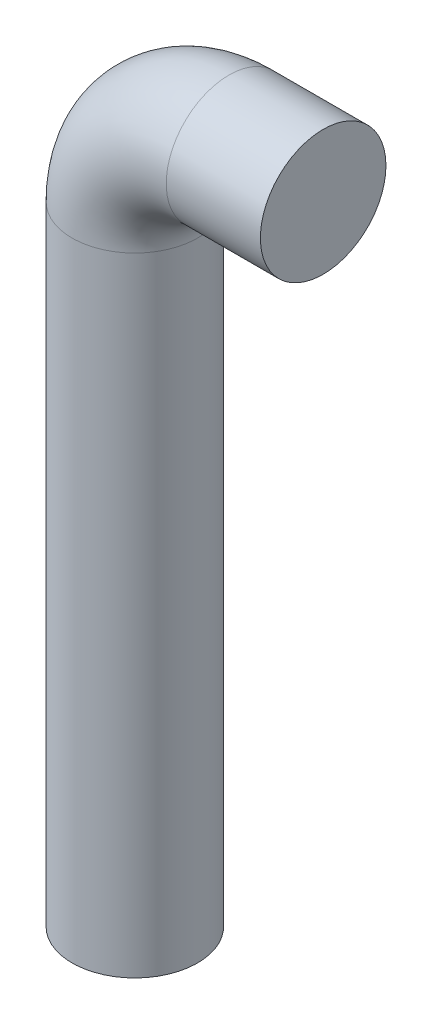
ISO-10303-21;
HEADER;
FILE_DESCRIPTION(('STEP AP214'),'2;1');
FILE_NAME('part.step','',(''),(''),'','','');
FILE_SCHEMA(('AUTOMOTIVE_DESIGN { 1 0 10303 214 1 1 1 1 }'));
ENDSEC;
DATA;
#1=APPLICATION_CONTEXT('core data for automotive mechanical design processes');
#2=APPLICATION_PROTOCOL_DEFINITION('international standard','automotive_design',2000,#1);
#3=PRODUCT_CONTEXT('',#1,'mechanical');
#4=PRODUCT('Part','Part','',(#3));
#5=PRODUCT_RELATED_PRODUCT_CATEGORY('part','',(#4));
#6=PRODUCT_DEFINITION_FORMATION('','',#4);
#7=PRODUCT_DEFINITION_CONTEXT('part definition',#1,'design');
#8=PRODUCT_DEFINITION('design','',#6,#7);
#9=PRODUCT_DEFINITION_SHAPE('','',#8);
#10=(LENGTH_UNIT() NAMED_UNIT(*) SI_UNIT(.MILLI.,.METRE.));
#11=(NAMED_UNIT(*) PLANE_ANGLE_UNIT() SI_UNIT($,.RADIAN.));
#12=(NAMED_UNIT(*) SI_UNIT($,.STERADIAN.) SOLID_ANGLE_UNIT());
#13=UNCERTAINTY_MEASURE_WITH_UNIT(LENGTH_MEASURE(1.E-05),#10,'distance_accuracy_value','');
#14=(GEOMETRIC_REPRESENTATION_CONTEXT(3) GLOBAL_UNCERTAINTY_ASSIGNED_CONTEXT((#13)) GLOBAL_UNIT_ASSIGNED_CONTEXT((#10,
#11,#12)) REPRESENTATION_CONTEXT('',''));
#15=CARTESIAN_POINT('',(0.,0.,0.));
#16=DIRECTION('',(0.,0.,1.));
#17=DIRECTION('',(1.,0.,0.));
#18=AXIS2_PLACEMENT_3D('',#15,#16,#17);
#19=CARTESIAN_POINT('',(0.,0.,0.));
#20=DIRECTION('',(1.,0.,0.));
#21=DIRECTION('',(0.,0.,-1.));
#22=AXIS2_PLACEMENT_3D('',#19,#20,#21);
#23=PLANE('',#22);
#24=CARTESIAN_POINT('',(0.,0.,0.));
#25=DIRECTION('',(1.,0.,0.));
#26=DIRECTION('',(0.,0.,-1.));
#27=AXIS2_PLACEMENT_3D('',#24,#25,#26);
#28=CIRCLE('',#27,2.);
#29=CARTESIAN_POINT('',(0.,0.,-2.));
#30=VERTEX_POINT('',#29);
#31=EDGE_CURVE('E45',#30,#30,#28,.T.);
#32=ORIENTED_EDGE('',*,*,#31,.T.);
#33=EDGE_LOOP('',(#32));
#34=FACE_BOUND('',#33,.T.);
#35=ADVANCED_FACE('F33',(#34),#23,.T.);
#36=CARTESIAN_POINT('',(-6.,-23.,0.));
#37=DIRECTION('',(0.,1.,0.));
#38=DIRECTION('',(0.,0.,-1.));
#39=AXIS2_PLACEMENT_3D('',#36,#37,#38);
#40=PLANE('',#39);
#41=CARTESIAN_POINT('',(-6.,-23.,0.));
#42=DIRECTION('',(0.,1.,0.));
#43=DIRECTION('',(0.,0.,-1.));
#44=AXIS2_PLACEMENT_3D('',#41,#42,#43);
#45=CIRCLE('',#44,2.);
#46=CARTESIAN_POINT('',(-6.,-23.,-2.));
#47=VERTEX_POINT('',#46);
#48=EDGE_CURVE('E11',#47,#47,#45,.T.);
#49=ORIENTED_EDGE('',*,*,#48,.F.);
#50=EDGE_LOOP('',(#49));
#51=FACE_BOUND('',#50,.T.);
#52=ADVANCED_FACE('F51',(#51),#40,.F.);
#53=CARTESIAN_POINT('',(0.,0.,0.));
#54=DIRECTION('',(-1.,0.,0.));
#55=DIRECTION('',(0.,-1.,0.));
#56=AXIS2_PLACEMENT_3D('',#53,#54,#55);
#57=CYLINDRICAL_SURFACE('',#56,2.);
#58=CARTESIAN_POINT('',(-3.,0.,0.));
#59=DIRECTION('',(1.,0.,0.));
#60=DIRECTION('',(0.,0.,-1.));
#61=AXIS2_PLACEMENT_3D('',#58,#59,#60);
#62=CIRCLE('',#61,2.);
#63=CARTESIAN_POINT('',(-3.,2.,0.));
#64=VERTEX_POINT('',#63);
#65=EDGE_CURVE('E76',#64,#64,#62,.T.);
#66=ORIENTED_EDGE('',*,*,#65,.T.);
#67=EDGE_LOOP('',(#66));
#68=FACE_BOUND('',#67,.T.);
#69=ORIENTED_EDGE('',*,*,#31,.F.);
#70=EDGE_LOOP('',(#69));
#71=FACE_BOUND('',#70,.T.);
#72=ADVANCED_FACE('F53',(#68,#71),#57,.T.);
#73=CARTESIAN_POINT('',(-3.,-3.,0.));
#74=DIRECTION('',(0.,0.,1.));
#75=DIRECTION('',(1.,0.,0.));
#76=AXIS2_PLACEMENT_3D('',#73,#74,#75);
#77=TOROIDAL_SURFACE('',#76,3.,2.);
#78=CARTESIAN_POINT('',(-6.,-3.,0.));
#79=DIRECTION('',(0.,1.,0.));
#80=DIRECTION('',(0.,0.,-1.));
#81=AXIS2_PLACEMENT_3D('',#78,#79,#80);
#82=CIRCLE('',#81,2.);
#83=CARTESIAN_POINT('',(-8.,-3.,0.));
#84=VERTEX_POINT('',#83);
#85=EDGE_CURVE('E40',#84,#84,#82,.T.);
#86=CARTESIAN_POINT('',(-3.,-3.,0.));
#87=DIRECTION('',(0.,0.,1.));
#88=DIRECTION('',(1.,0.,0.));
#89=AXIS2_PLACEMENT_3D('',#86,#87,#88);
#90=CIRCLE('',#89,5.);
#91=EDGE_CURVE('',#64,#84,#90,.T.);
#92=ORIENTED_EDGE('',*,*,#65,.F.);
#93=ORIENTED_EDGE('',*,*,#85,.T.);
#94=ORIENTED_EDGE('',*,*,#91,.T.);
#95=ORIENTED_EDGE('',*,*,#91,.F.);
#96=EDGE_LOOP('',(#92,#94,#93,#95));
#97=FACE_BOUND('',#96,.T.);
#98=ADVANCED_FACE('F58',(#97),#77,.T.);
#99=CARTESIAN_POINT('',(-6.,-3.,0.));
#100=DIRECTION('',(0.,-1.,0.));
#101=DIRECTION('',(0.,0.,-1.));
#102=AXIS2_PLACEMENT_3D('',#99,#100,#101);
#103=CYLINDRICAL_SURFACE('',#102,2.);
#104=ORIENTED_EDGE('',*,*,#48,.T.);
#105=EDGE_LOOP('',(#104));
#106=FACE_BOUND('',#105,.T.);
#107=ORIENTED_EDGE('',*,*,#85,.F.);
#108=EDGE_LOOP('',(#107));
#109=FACE_BOUND('',#108,.T.);
#110=ADVANCED_FACE('F48',(#106,#109),#103,.T.);
#111=CLOSED_SHELL('',(#35,#52,#72,#98,#110));
#112=MANIFOLD_SOLID_BREP('B2',#111);
#113=ADVANCED_BREP_SHAPE_REPRESENTATION('',(#18,#112),#14);
#114=SHAPE_DEFINITION_REPRESENTATION(#9,#113);
ENDSEC;
END-ISO-10303-21;
